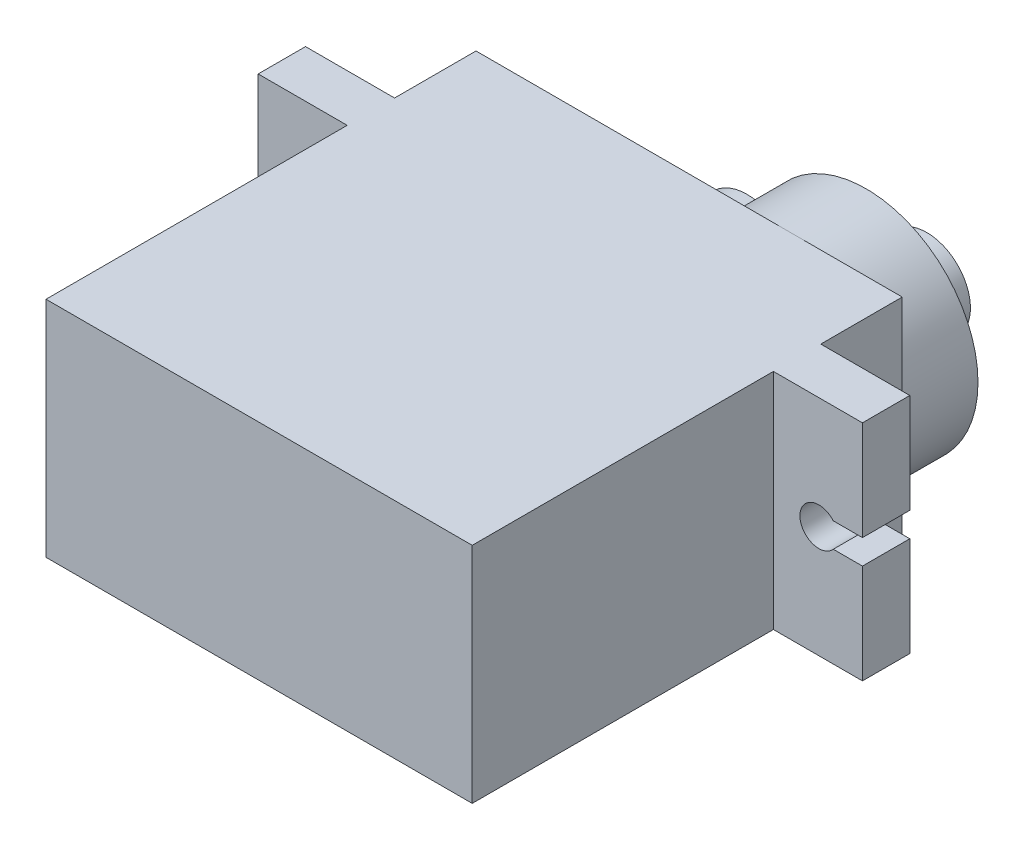
ISO-10303-21;
HEADER;
FILE_DESCRIPTION(('STEP AP214'),'2;1');
FILE_NAME('part.step','',(''),(''),'','','');
FILE_SCHEMA(('AUTOMOTIVE_DESIGN { 1 0 10303 214 1 1 1 1 }'));
ENDSEC;
DATA;
#1=APPLICATION_CONTEXT('core data for automotive mechanical design processes');
#2=APPLICATION_PROTOCOL_DEFINITION('international standard','automotive_design',2000,#1);
#3=PRODUCT_CONTEXT('',#1,'mechanical');
#4=PRODUCT('Part','Part','',(#3));
#5=PRODUCT_RELATED_PRODUCT_CATEGORY('part','',(#4));
#6=PRODUCT_DEFINITION_FORMATION('','',#4);
#7=PRODUCT_DEFINITION_CONTEXT('part definition',#1,'design');
#8=PRODUCT_DEFINITION('design','',#6,#7);
#9=PRODUCT_DEFINITION_SHAPE('','',#8);
#10=(LENGTH_UNIT() NAMED_UNIT(*) SI_UNIT(.MILLI.,.METRE.));
#11=(NAMED_UNIT(*) PLANE_ANGLE_UNIT() SI_UNIT($,.RADIAN.));
#12=(NAMED_UNIT(*) SI_UNIT($,.STERADIAN.) SOLID_ANGLE_UNIT());
#13=UNCERTAINTY_MEASURE_WITH_UNIT(LENGTH_MEASURE(1.E-05),#10,'distance_accuracy_value','');
#14=(GEOMETRIC_REPRESENTATION_CONTEXT(3) GLOBAL_UNCERTAINTY_ASSIGNED_CONTEXT((#13)) GLOBAL_UNIT_ASSIGNED_CONTEXT((#10,
#11,#12)) REPRESENTATION_CONTEXT('',''));
#15=CARTESIAN_POINT('',(0.,0.,0.));
#16=DIRECTION('',(0.,0.,1.));
#17=DIRECTION('',(1.,0.,0.));
#18=AXIS2_PLACEMENT_3D('',#15,#16,#17);
#19=CARTESIAN_POINT('',(27.2,0.,-18.4));
#20=DIRECTION('',(1.,0.,0.));
#21=DIRECTION('',(0.,0.,-1.));
#22=AXIS2_PLACEMENT_3D('',#19,#20,#21);
#23=PLANE('',#22);
#24=DIRECTION('',(0.,0.,-1.));
#25=VECTOR('',#24,1.);
#26=CARTESIAN_POINT('',(27.2,5.25,-15.2));
#27=LINE('',#26,#25);
#28=CARTESIAN_POINT('',(27.2,5.25,-15.9));
#29=VERTEX_POINT('',#28);
#30=CARTESIAN_POINT('',(27.2,5.25,-18.4));
#31=VERTEX_POINT('',#30);
#32=EDGE_CURVE('E216',#29,#31,#27,.T.);
#33=ORIENTED_EDGE('',*,*,#32,.F.);
#34=DIRECTION('',(0.,1.,0.));
#35=VECTOR('',#34,1.);
#36=CARTESIAN_POINT('',(27.2,0.,-15.9));
#37=LINE('',#36,#35);
#38=CARTESIAN_POINT('',(27.2,0.,-15.9));
#39=VERTEX_POINT('',#38);
#40=EDGE_CURVE('E297',#39,#29,#37,.T.);
#41=ORIENTED_EDGE('',*,*,#40,.F.);
#42=DIRECTION('',(0.,0.,-1.));
#43=VECTOR('',#42,1.);
#44=CARTESIAN_POINT('',(27.2,0.,-18.4));
#45=LINE('',#44,#43);
#46=CARTESIAN_POINT('',(27.2,0.,-18.4));
#47=VERTEX_POINT('',#46);
#48=EDGE_CURVE('E272',#39,#47,#45,.T.);
#49=ORIENTED_EDGE('',*,*,#48,.T.);
#50=DIRECTION('',(0.,1.,0.));
#51=VECTOR('',#50,1.);
#52=CARTESIAN_POINT('',(27.2,0.,-18.4));
#53=LINE('',#52,#51);
#54=EDGE_CURVE('E294',#47,#31,#53,.T.);
#55=ORIENTED_EDGE('',*,*,#54,.T.);
#56=EDGE_LOOP('',(#33,#41,#49,#55));
#57=FACE_BOUND('',#56,.T.);
#58=ADVANCED_FACE('F33',(#57),#23,.T.);
#59=CARTESIAN_POINT('',(-4.7,0.,-18.4));
#60=DIRECTION('',(-1.,0.,0.));
#61=DIRECTION('',(0.,0.,1.));
#62=AXIS2_PLACEMENT_3D('',#59,#60,#61);
#63=PLANE('',#62);
#64=DIRECTION('',(0.,0.,-1.));
#65=VECTOR('',#64,1.);
#66=CARTESIAN_POINT('',(-4.7,6.55,-18.4));
#67=LINE('',#66,#65);
#68=CARTESIAN_POINT('',(-4.7,6.55,-15.9));
#69=VERTEX_POINT('',#68);
#70=CARTESIAN_POINT('',(-4.7,6.55,-18.4));
#71=VERTEX_POINT('',#70);
#72=EDGE_CURVE('E41',#69,#71,#67,.T.);
#73=ORIENTED_EDGE('',*,*,#72,.F.);
#74=DIRECTION('',(0.,1.,0.));
#75=VECTOR('',#74,1.);
#76=CARTESIAN_POINT('',(-4.7,0.,-15.9));
#77=LINE('',#76,#75);
#78=CARTESIAN_POINT('',(-4.7,11.8,-15.9));
#79=VERTEX_POINT('',#78);
#80=EDGE_CURVE('E278',#69,#79,#77,.T.);
#81=ORIENTED_EDGE('',*,*,#80,.T.);
#82=DIRECTION('',(0.,0.,1.));
#83=VECTOR('',#82,1.);
#84=CARTESIAN_POINT('',(-4.7,11.8,-18.4));
#85=LINE('',#84,#83);
#86=CARTESIAN_POINT('',(-4.7,11.8,-18.4));
#87=VERTEX_POINT('',#86);
#88=EDGE_CURVE('E264',#87,#79,#85,.T.);
#89=ORIENTED_EDGE('',*,*,#88,.F.);
#90=DIRECTION('',(0.,1.,0.));
#91=VECTOR('',#90,1.);
#92=CARTESIAN_POINT('',(-4.7,0.,-18.4));
#93=LINE('',#92,#91);
#94=EDGE_CURVE('E293',#71,#87,#93,.T.);
#95=ORIENTED_EDGE('',*,*,#94,.F.);
#96=EDGE_LOOP('',(#73,#81,#89,#95));
#97=FACE_BOUND('',#96,.T.);
#98=ADVANCED_FACE('F371',(#97),#63,.T.);
#99=CARTESIAN_POINT('',(0.,11.8,-22.7));
#100=DIRECTION('',(0.,0.,1.));
#101=DIRECTION('',(1.,0.,0.));
#102=AXIS2_PLACEMENT_3D('',#99,#100,#101);
#103=PLANE('',#102);
#104=CARTESIAN_POINT('',(10.3,5.9,-22.7));
#105=DIRECTION('',(0.,0.,-1.));
#106=DIRECTION('',(-1.,0.,0.));
#107=AXIS2_PLACEMENT_3D('',#104,#105,#106);
#108=CIRCLE('',#107,2.5);
#109=CARTESIAN_POINT('',(11.1833333333333,3.5612562726493,-22.7));
#110=VERTEX_POINT('',#109);
#111=CARTESIAN_POINT('',(11.1833333333333,8.2387437273507,-22.7));
#112=VERTEX_POINT('',#111);
#113=EDGE_CURVE('E243',#110,#112,#108,.T.);
#114=ORIENTED_EDGE('',*,*,#113,.F.);
#115=CARTESIAN_POINT('',(16.6,5.9,-22.7));
#116=DIRECTION('',(0.,0.,-1.));
#117=DIRECTION('',(-1.,0.,0.));
#118=AXIS2_PLACEMENT_3D('',#115,#116,#117);
#119=CIRCLE('',#118,5.9);
#120=CARTESIAN_POINT('',(16.6,0.,-22.7));
#121=VERTEX_POINT('',#120);
#122=EDGE_CURVE('E258',#121,#110,#119,.T.);
#123=ORIENTED_EDGE('',*,*,#122,.F.);
#124=DIRECTION('',(-1.,0.,0.));
#125=VECTOR('',#124,1.);
#126=CARTESIAN_POINT('',(0.,0.,-22.7));
#127=LINE('',#126,#125);
#128=CARTESIAN_POINT('',(0.,0.,-22.7));
#129=VERTEX_POINT('',#128);
#130=EDGE_CURVE('E340',#121,#129,#127,.T.);
#131=ORIENTED_EDGE('',*,*,#130,.T.);
#132=DIRECTION('',(0.,-1.,0.));
#133=VECTOR('',#132,1.);
#134=CARTESIAN_POINT('',(0.,11.8,-22.7));
#135=LINE('',#134,#133);
#136=CARTESIAN_POINT('',(0.,11.8,-22.7));
#137=VERTEX_POINT('',#136);
#138=EDGE_CURVE('E330',#137,#129,#135,.T.);
#139=ORIENTED_EDGE('',*,*,#138,.F.);
#140=DIRECTION('',(-1.,0.,0.));
#141=VECTOR('',#140,1.);
#142=CARTESIAN_POINT('',(0.,11.8,-22.7));
#143=LINE('',#142,#141);
#144=CARTESIAN_POINT('',(16.6,11.8,-22.7));
#145=VERTEX_POINT('',#144);
#146=EDGE_CURVE('E326',#145,#137,#143,.T.);
#147=ORIENTED_EDGE('',*,*,#146,.F.);
#148=EDGE_CURVE('E250',#112,#145,#119,.T.);
#149=ORIENTED_EDGE('',*,*,#148,.F.);
#150=EDGE_LOOP('',(#114,#123,#131,#139,#147,#149));
#151=FACE_BOUND('',#150,.T.);
#152=ADVANCED_FACE('F419',(#151),#103,.F.);
#153=CARTESIAN_POINT('',(22.5,5.9,-22.7));
#154=VERTEX_POINT('',#153);
#155=EDGE_CURVE('E257',#145,#154,#119,.T.);
#156=ORIENTED_EDGE('',*,*,#155,.F.);
#157=CARTESIAN_POINT('',(22.5,11.8,-22.7));
#158=VERTEX_POINT('',#157);
#159=EDGE_CURVE('E327',#158,#145,#143,.T.);
#160=ORIENTED_EDGE('',*,*,#159,.F.);
#161=DIRECTION('',(0.,-1.,0.));
#162=VECTOR('',#161,1.);
#163=CARTESIAN_POINT('',(22.5,11.8,-22.7));
#164=LINE('',#163,#162);
#165=EDGE_CURVE('E347',#158,#154,#164,.T.);
#166=ORIENTED_EDGE('',*,*,#165,.T.);
#167=EDGE_LOOP('',(#156,#160,#166));
#168=FACE_BOUND('',#167,.T.);
#169=ADVANCED_FACE('F476',(#168),#103,.F.);
#170=CARTESIAN_POINT('',(0.,11.8,0.));
#171=DIRECTION('',(1.,0.,0.));
#172=DIRECTION('',(0.,0.,-1.));
#173=AXIS2_PLACEMENT_3D('',#170,#171,#172);
#174=PLANE('',#173);
#175=DIRECTION('',(0.,0.,1.));
#176=VECTOR('',#175,1.);
#177=CARTESIAN_POINT('',(0.,0.,0.));
#178=LINE('',#177,#176);
#179=CARTESIAN_POINT('',(0.,0.,-18.4));
#180=VERTEX_POINT('',#179);
#181=EDGE_CURVE('E331',#129,#180,#178,.T.);
#182=ORIENTED_EDGE('',*,*,#181,.T.);
#183=DIRECTION('',(0.,1.,0.));
#184=VECTOR('',#183,1.);
#185=CARTESIAN_POINT('',(0.,11.8,-18.4));
#186=LINE('',#185,#184);
#187=CARTESIAN_POINT('',(0.,11.8,-18.4));
#188=VERTEX_POINT('',#187);
#189=EDGE_CURVE('E312',#180,#188,#186,.T.);
#190=ORIENTED_EDGE('',*,*,#189,.T.);
#191=DIRECTION('',(0.,0.,1.));
#192=VECTOR('',#191,1.);
#193=CARTESIAN_POINT('',(0.,11.8,0.));
#194=LINE('',#193,#192);
#195=EDGE_CURVE('E316',#137,#188,#194,.T.);
#196=ORIENTED_EDGE('',*,*,#195,.F.);
#197=ORIENTED_EDGE('',*,*,#138,.T.);
#198=EDGE_LOOP('',(#182,#190,#196,#197));
#199=FACE_BOUND('',#198,.T.);
#200=ADVANCED_FACE('F379',(#199),#174,.F.);
#201=CARTESIAN_POINT('',(22.5,11.8,0.));
#202=DIRECTION('',(-1.,0.,0.));
#203=DIRECTION('',(0.,0.,1.));
#204=AXIS2_PLACEMENT_3D('',#201,#202,#203);
#205=PLANE('',#204);
#206=DIRECTION('',(0.,0.,-1.));
#207=VECTOR('',#206,1.);
#208=CARTESIAN_POINT('',(22.5,11.8,0.));
#209=LINE('',#208,#207);
#210=CARTESIAN_POINT('',(22.5,11.8,-18.4));
#211=VERTEX_POINT('',#210);
#212=EDGE_CURVE('E322',#211,#158,#209,.T.);
#213=ORIENTED_EDGE('',*,*,#212,.F.);
#214=DIRECTION('',(0.,-1.,0.));
#215=VECTOR('',#214,1.);
#216=CARTESIAN_POINT('',(22.5,11.8,-18.4));
#217=LINE('',#216,#215);
#218=CARTESIAN_POINT('',(22.5,0.,-18.4));
#219=VERTEX_POINT('',#218);
#220=EDGE_CURVE('E309',#211,#219,#217,.T.);
#221=ORIENTED_EDGE('',*,*,#220,.T.);
#222=DIRECTION('',(0.,0.,-1.));
#223=VECTOR('',#222,1.);
#224=CARTESIAN_POINT('',(22.5,0.,0.));
#225=LINE('',#224,#223);
#226=CARTESIAN_POINT('',(22.5,0.,-22.7));
#227=VERTEX_POINT('',#226);
#228=EDGE_CURVE('E336',#219,#227,#225,.T.);
#229=ORIENTED_EDGE('',*,*,#228,.T.);
#230=EDGE_CURVE('E346',#154,#227,#164,.T.);
#231=ORIENTED_EDGE('',*,*,#230,.F.);
#232=ORIENTED_EDGE('',*,*,#165,.F.);
#233=EDGE_LOOP('',(#213,#221,#229,#231,#232));
#234=FACE_BOUND('',#233,.T.);
#235=ADVANCED_FACE('F460',(#234),#205,.F.);
#236=CARTESIAN_POINT('',(0.,11.8,-15.9));
#237=VERTEX_POINT('',#236);
#238=CARTESIAN_POINT('',(0.,11.8,0.));
#239=VERTEX_POINT('',#238);
#240=EDGE_CURVE('E320',#237,#239,#194,.T.);
#241=ORIENTED_EDGE('',*,*,#240,.F.);
#242=DIRECTION('',(0.,-1.,0.));
#243=VECTOR('',#242,1.);
#244=CARTESIAN_POINT('',(0.,11.8,-15.9));
#245=LINE('',#244,#243);
#246=CARTESIAN_POINT('',(0.,0.,-15.9));
#247=VERTEX_POINT('',#246);
#248=EDGE_CURVE('E306',#237,#247,#245,.T.);
#249=ORIENTED_EDGE('',*,*,#248,.T.);
#250=CARTESIAN_POINT('',(0.,0.,0.));
#251=VERTEX_POINT('',#250);
#252=EDGE_CURVE('E315',#247,#251,#178,.T.);
#253=ORIENTED_EDGE('',*,*,#252,.T.);
#254=DIRECTION('',(0.,-1.,0.));
#255=VECTOR('',#254,1.);
#256=CARTESIAN_POINT('',(0.,11.8,0.));
#257=LINE('',#256,#255);
#258=EDGE_CURVE('E353',#239,#251,#257,.T.);
#259=ORIENTED_EDGE('',*,*,#258,.F.);
#260=EDGE_LOOP('',(#241,#249,#253,#259));
#261=FACE_BOUND('',#260,.T.);
#262=ADVANCED_FACE('F35',(#261),#174,.F.);
#263=CARTESIAN_POINT('',(0.,11.8,0.));
#264=DIRECTION('',(0.,0.,-1.));
#265=DIRECTION('',(-1.,0.,0.));
#266=AXIS2_PLACEMENT_3D('',#263,#264,#265);
#267=PLANE('',#266);
#268=DIRECTION('',(1.,0.,0.));
#269=VECTOR('',#268,1.);
#270=CARTESIAN_POINT('',(0.,0.,0.));
#271=LINE('',#270,#269);
#272=CARTESIAN_POINT('',(22.5,0.,0.));
#273=VERTEX_POINT('',#272);
#274=EDGE_CURVE('E334',#251,#273,#271,.T.);
#275=ORIENTED_EDGE('',*,*,#274,.T.);
#276=DIRECTION('',(0.,-1.,0.));
#277=VECTOR('',#276,1.);
#278=CARTESIAN_POINT('',(22.5,11.8,0.));
#279=LINE('',#278,#277);
#280=CARTESIAN_POINT('',(22.5,11.8,0.));
#281=VERTEX_POINT('',#280);
#282=EDGE_CURVE('E350',#281,#273,#279,.T.);
#283=ORIENTED_EDGE('',*,*,#282,.F.);
#284=DIRECTION('',(1.,0.,0.));
#285=VECTOR('',#284,1.);
#286=CARTESIAN_POINT('',(0.,11.8,0.));
#287=LINE('',#286,#285);
#288=EDGE_CURVE('E319',#239,#281,#287,.T.);
#289=ORIENTED_EDGE('',*,*,#288,.F.);
#290=ORIENTED_EDGE('',*,*,#258,.T.);
#291=EDGE_LOOP('',(#275,#283,#289,#290));
#292=FACE_BOUND('',#291,.T.);
#293=ADVANCED_FACE('F450',(#292),#267,.F.);
#294=CARTESIAN_POINT('',(22.5,0.,-15.9));
#295=VERTEX_POINT('',#294);
#296=EDGE_CURVE('E337',#273,#295,#225,.T.);
#297=ORIENTED_EDGE('',*,*,#296,.T.);
#298=DIRECTION('',(0.,1.,0.));
#299=VECTOR('',#298,1.);
#300=CARTESIAN_POINT('',(22.5,11.8,-15.9));
#301=LINE('',#300,#299);
#302=CARTESIAN_POINT('',(22.5,11.8,-15.9));
#303=VERTEX_POINT('',#302);
#304=EDGE_CURVE('E292',#295,#303,#301,.T.);
#305=ORIENTED_EDGE('',*,*,#304,.T.);
#306=EDGE_CURVE('E323',#281,#303,#209,.T.);
#307=ORIENTED_EDGE('',*,*,#306,.F.);
#308=ORIENTED_EDGE('',*,*,#282,.T.);
#309=EDGE_LOOP('',(#297,#305,#307,#308));
#310=FACE_BOUND('',#309,.T.);
#311=ADVANCED_FACE('F445',(#310),#205,.F.);
#312=EDGE_CURVE('E473',#154,#121,#119,.T.);
#313=ORIENTED_EDGE('',*,*,#312,.F.);
#314=ORIENTED_EDGE('',*,*,#230,.T.);
#315=EDGE_CURVE('E341',#227,#121,#127,.T.);
#316=ORIENTED_EDGE('',*,*,#315,.T.);
#317=EDGE_LOOP('',(#313,#314,#316));
#318=FACE_BOUND('',#317,.T.);
#319=ADVANCED_FACE('F475',(#318),#103,.F.);
#320=CARTESIAN_POINT('',(0.,11.8,0.));
#321=DIRECTION('',(0.,-1.,0.));
#322=DIRECTION('',(0.,0.,-1.));
#323=AXIS2_PLACEMENT_3D('',#320,#321,#322);
#324=PLANE('',#323);
#325=ORIENTED_EDGE('',*,*,#306,.T.);
#326=DIRECTION('',(1.,0.,0.));
#327=VECTOR('',#326,1.);
#328=CARTESIAN_POINT('',(-4.7,11.8,-15.9));
#329=LINE('',#328,#327);
#330=CARTESIAN_POINT('',(27.2,11.8,-15.9));
#331=VERTEX_POINT('',#330);
#332=EDGE_CURVE('E281',#303,#331,#329,.T.);
#333=ORIENTED_EDGE('',*,*,#332,.T.);
#334=DIRECTION('',(0.,0.,-1.));
#335=VECTOR('',#334,1.);
#336=CARTESIAN_POINT('',(27.2,11.8,-18.4));
#337=LINE('',#336,#335);
#338=CARTESIAN_POINT('',(27.2,11.8,-18.4));
#339=VERTEX_POINT('',#338);
#340=EDGE_CURVE('E284',#331,#339,#337,.T.);
#341=ORIENTED_EDGE('',*,*,#340,.T.);
#342=DIRECTION('',(-1.,0.,0.));
#343=VECTOR('',#342,1.);
#344=CARTESIAN_POINT('',(-4.7,11.8,-18.4));
#345=LINE('',#344,#343);
#346=EDGE_CURVE('E269',#339,#211,#345,.T.);
#347=ORIENTED_EDGE('',*,*,#346,.T.);
#348=ORIENTED_EDGE('',*,*,#212,.T.);
#349=ORIENTED_EDGE('',*,*,#159,.T.);
#350=ORIENTED_EDGE('',*,*,#146,.T.);
#351=ORIENTED_EDGE('',*,*,#195,.T.);
#352=EDGE_CURVE('E287',#188,#87,#345,.T.);
#353=ORIENTED_EDGE('',*,*,#352,.T.);
#354=ORIENTED_EDGE('',*,*,#88,.T.);
#355=EDGE_CURVE('E282',#79,#237,#329,.T.);
#356=ORIENTED_EDGE('',*,*,#355,.T.);
#357=ORIENTED_EDGE('',*,*,#240,.T.);
#358=ORIENTED_EDGE('',*,*,#288,.T.);
#359=EDGE_LOOP('',(#325,#333,#341,#347,#348,#349,#350,#351,#353,#354,#356,#357,#358));
#360=FACE_BOUND('',#359,.T.);
#361=ADVANCED_FACE('F374',(#360),#324,.F.);
#362=CARTESIAN_POINT('',(0.,0.,0.));
#363=DIRECTION('',(0.,-1.,0.));
#364=DIRECTION('',(0.,0.,-1.));
#365=AXIS2_PLACEMENT_3D('',#362,#363,#364);
#366=PLANE('',#365);
#367=ORIENTED_EDGE('',*,*,#252,.F.);
#368=DIRECTION('',(1.,0.,0.));
#369=VECTOR('',#368,1.);
#370=CARTESIAN_POINT('',(-4.7,0.,-15.9));
#371=LINE('',#370,#369);
#372=CARTESIAN_POINT('',(-4.7,0.,-15.9));
#373=VERTEX_POINT('',#372);
#374=EDGE_CURVE('E270',#373,#247,#371,.T.);
#375=ORIENTED_EDGE('',*,*,#374,.F.);
#376=DIRECTION('',(0.,0.,1.));
#377=VECTOR('',#376,1.);
#378=CARTESIAN_POINT('',(-4.7,0.,-18.4));
#379=LINE('',#378,#377);
#380=CARTESIAN_POINT('',(-4.7,0.,-18.4));
#381=VERTEX_POINT('',#380);
#382=EDGE_CURVE('E265',#381,#373,#379,.T.);
#383=ORIENTED_EDGE('',*,*,#382,.F.);
#384=DIRECTION('',(-1.,0.,0.));
#385=VECTOR('',#384,1.);
#386=CARTESIAN_POINT('',(-4.7,0.,-18.4));
#387=LINE('',#386,#385);
#388=EDGE_CURVE('E275',#180,#381,#387,.T.);
#389=ORIENTED_EDGE('',*,*,#388,.F.);
#390=ORIENTED_EDGE('',*,*,#181,.F.);
#391=ORIENTED_EDGE('',*,*,#130,.F.);
#392=ORIENTED_EDGE('',*,*,#315,.F.);
#393=ORIENTED_EDGE('',*,*,#228,.F.);
#394=EDGE_CURVE('E276',#47,#219,#387,.T.);
#395=ORIENTED_EDGE('',*,*,#394,.F.);
#396=ORIENTED_EDGE('',*,*,#48,.F.);
#397=EDGE_CURVE('E268',#295,#39,#371,.T.);
#398=ORIENTED_EDGE('',*,*,#397,.F.);
#399=ORIENTED_EDGE('',*,*,#296,.F.);
#400=ORIENTED_EDGE('',*,*,#274,.F.);
#401=EDGE_LOOP('',(#367,#375,#383,#389,#390,#391,#392,#393,#395,#396,#398,#399,#400));
#402=FACE_BOUND('',#401,.T.);
#403=ADVANCED_FACE('F385',(#402),#366,.T.);
#404=DIRECTION('',(0.,0.,-1.));
#405=VECTOR('',#404,1.);
#406=CARTESIAN_POINT('',(27.2,6.55,-15.2));
#407=LINE('',#406,#405);
#408=CARTESIAN_POINT('',(27.2,6.55,-15.9));
#409=VERTEX_POINT('',#408);
#410=CARTESIAN_POINT('',(27.2,6.55,-18.4));
#411=VERTEX_POINT('',#410);
#412=EDGE_CURVE('E200',#409,#411,#407,.T.);
#413=ORIENTED_EDGE('',*,*,#412,.T.);
#414=EDGE_CURVE('E211',#411,#339,#53,.T.);
#415=ORIENTED_EDGE('',*,*,#414,.T.);
#416=ORIENTED_EDGE('',*,*,#340,.F.);
#417=EDGE_CURVE('E300',#409,#331,#37,.T.);
#418=ORIENTED_EDGE('',*,*,#417,.F.);
#419=EDGE_LOOP('',(#413,#415,#416,#418));
#420=FACE_BOUND('',#419,.T.);
#421=ADVANCED_FACE('F415',(#420),#23,.T.);
#422=CARTESIAN_POINT('',(-4.7,0.,-15.9));
#423=DIRECTION('',(0.,0.,1.));
#424=DIRECTION('',(1.,0.,0.));
#425=AXIS2_PLACEMENT_3D('',#422,#423,#424);
#426=PLANE('',#425);
#427=DIRECTION('',(1.,0.,0.));
#428=VECTOR('',#427,1.);
#429=CARTESIAN_POINT('',(-4.7,5.25,-15.9));
#430=LINE('',#429,#428);
#431=CARTESIAN_POINT('',(25.6599342076785,5.25,-15.9));
#432=VERTEX_POINT('',#431);
#433=EDGE_CURVE('E237',#432,#29,#430,.T.);
#434=ORIENTED_EDGE('',*,*,#433,.F.);
#435=CARTESIAN_POINT('',(24.9,5.9,-15.9));
#436=DIRECTION('',(0.,0.,1.));
#437=DIRECTION('',(1.,0.,0.));
#438=AXIS2_PLACEMENT_3D('',#435,#436,#437);
#439=CIRCLE('',#438,1.);
#440=CARTESIAN_POINT('',(25.6599342076785,6.55,-15.9));
#441=VERTEX_POINT('',#440);
#442=EDGE_CURVE('E234',#441,#432,#439,.T.);
#443=ORIENTED_EDGE('',*,*,#442,.F.);
#444=DIRECTION('',(-1.,0.,0.));
#445=VECTOR('',#444,1.);
#446=CARTESIAN_POINT('',(-4.7,6.55,-15.9));
#447=LINE('',#446,#445);
#448=EDGE_CURVE('E197',#409,#441,#447,.T.);
#449=ORIENTED_EDGE('',*,*,#448,.F.);
#450=ORIENTED_EDGE('',*,*,#417,.T.);
#451=ORIENTED_EDGE('',*,*,#332,.F.);
#452=ORIENTED_EDGE('',*,*,#304,.F.);
#453=ORIENTED_EDGE('',*,*,#397,.T.);
#454=ORIENTED_EDGE('',*,*,#40,.T.);
#455=EDGE_LOOP('',(#434,#443,#449,#450,#451,#452,#453,#454));
#456=FACE_BOUND('',#455,.T.);
#457=ADVANCED_FACE('F425',(#456),#426,.T.);
#458=CARTESIAN_POINT('',(-4.7,0.,-18.4));
#459=DIRECTION('',(0.,0.,-1.));
#460=DIRECTION('',(-1.,0.,0.));
#461=AXIS2_PLACEMENT_3D('',#458,#459,#460);
#462=PLANE('',#461);
#463=DIRECTION('',(-1.,0.,0.));
#464=VECTOR('',#463,1.);
#465=CARTESIAN_POINT('',(27.2,5.25,-18.4));
#466=LINE('',#465,#464);
#467=CARTESIAN_POINT('',(25.6599342076785,5.25,-18.4));
#468=VERTEX_POINT('',#467);
#469=EDGE_CURVE('E48',#31,#468,#466,.T.);
#470=ORIENTED_EDGE('',*,*,#469,.F.);
#471=ORIENTED_EDGE('',*,*,#54,.F.);
#472=ORIENTED_EDGE('',*,*,#394,.T.);
#473=ORIENTED_EDGE('',*,*,#220,.F.);
#474=ORIENTED_EDGE('',*,*,#346,.F.);
#475=ORIENTED_EDGE('',*,*,#414,.F.);
#476=DIRECTION('',(1.,0.,0.));
#477=VECTOR('',#476,1.);
#478=CARTESIAN_POINT('',(27.2,6.55,-18.4));
#479=LINE('',#478,#477);
#480=CARTESIAN_POINT('',(25.6599342076785,6.55,-18.4));
#481=VERTEX_POINT('',#480);
#482=EDGE_CURVE('E194',#481,#411,#479,.T.);
#483=ORIENTED_EDGE('',*,*,#482,.F.);
#484=CARTESIAN_POINT('',(24.9,5.9,-18.4));
#485=DIRECTION('',(0.,0.,-1.));
#486=DIRECTION('',(-1.,0.,0.));
#487=AXIS2_PLACEMENT_3D('',#484,#485,#486);
#488=CIRCLE('',#487,1.);
#489=EDGE_CURVE('E204',#468,#481,#488,.T.);
#490=ORIENTED_EDGE('',*,*,#489,.F.);
#491=EDGE_LOOP('',(#470,#471,#472,#473,#474,#475,#483,#490));
#492=FACE_BOUND('',#491,.T.);
#493=ADVANCED_FACE('F209',(#492),#462,.T.);
#494=DIRECTION('',(1.,0.,0.));
#495=VECTOR('',#494,1.);
#496=CARTESIAN_POINT('',(-4.7,6.55,-18.4));
#497=LINE('',#496,#495);
#498=CARTESIAN_POINT('',(-3.15993420767853,6.55,-18.4));
#499=VERTEX_POINT('',#498);
#500=EDGE_CURVE('E224',#71,#499,#497,.T.);
#501=ORIENTED_EDGE('',*,*,#500,.F.);
#502=ORIENTED_EDGE('',*,*,#94,.T.);
#503=ORIENTED_EDGE('',*,*,#352,.F.);
#504=ORIENTED_EDGE('',*,*,#189,.F.);
#505=ORIENTED_EDGE('',*,*,#388,.T.);
#506=CARTESIAN_POINT('',(-4.7,5.25,-18.4));
#507=VERTEX_POINT('',#506);
#508=EDGE_CURVE('E289',#381,#507,#93,.T.);
#509=ORIENTED_EDGE('',*,*,#508,.T.);
#510=DIRECTION('',(-1.,0.,0.));
#511=VECTOR('',#510,1.);
#512=CARTESIAN_POINT('',(-4.7,5.25,-18.4));
#513=LINE('',#512,#511);
#514=CARTESIAN_POINT('',(-3.15993420767853,5.25,-18.4));
#515=VERTEX_POINT('',#514);
#516=EDGE_CURVE('E56',#515,#507,#513,.T.);
#517=ORIENTED_EDGE('',*,*,#516,.F.);
#518=CARTESIAN_POINT('',(-2.4,5.9,-18.4));
#519=DIRECTION('',(0.,0.,-1.));
#520=DIRECTION('',(1.,0.,0.));
#521=AXIS2_PLACEMENT_3D('',#518,#519,#520);
#522=CIRCLE('',#521,1.);
#523=EDGE_CURVE('E220',#499,#515,#522,.T.);
#524=ORIENTED_EDGE('',*,*,#523,.F.);
#525=EDGE_LOOP('',(#501,#502,#503,#504,#505,#509,#517,#524));
#526=FACE_BOUND('',#525,.T.);
#527=ADVANCED_FACE('F368',(#526),#462,.T.);
#528=DIRECTION('',(-1.,0.,0.));
#529=VECTOR('',#528,1.);
#530=CARTESIAN_POINT('',(-4.7,6.55,-15.9));
#531=LINE('',#530,#529);
#532=CARTESIAN_POINT('',(-3.15993420767853,6.55,-15.9));
#533=VERTEX_POINT('',#532);
#534=EDGE_CURVE('E232',#533,#69,#531,.T.);
#535=ORIENTED_EDGE('',*,*,#534,.F.);
#536=CARTESIAN_POINT('',(-2.4,5.9,-15.9));
#537=DIRECTION('',(0.,0.,1.));
#538=DIRECTION('',(1.,0.,0.));
#539=AXIS2_PLACEMENT_3D('',#536,#537,#538);
#540=CIRCLE('',#539,1.);
#541=CARTESIAN_POINT('',(-3.15993420767853,5.25,-15.9));
#542=VERTEX_POINT('',#541);
#543=EDGE_CURVE('E11',#542,#533,#540,.T.);
#544=ORIENTED_EDGE('',*,*,#543,.F.);
#545=DIRECTION('',(1.,0.,0.));
#546=VECTOR('',#545,1.);
#547=CARTESIAN_POINT('',(-4.7,5.25,-15.9));
#548=LINE('',#547,#546);
#549=CARTESIAN_POINT('',(-4.7,5.25,-15.9));
#550=VERTEX_POINT('',#549);
#551=EDGE_CURVE('E218',#550,#542,#548,.T.);
#552=ORIENTED_EDGE('',*,*,#551,.F.);
#553=EDGE_CURVE('E301',#373,#550,#77,.T.);
#554=ORIENTED_EDGE('',*,*,#553,.F.);
#555=ORIENTED_EDGE('',*,*,#374,.T.);
#556=ORIENTED_EDGE('',*,*,#248,.F.);
#557=ORIENTED_EDGE('',*,*,#355,.F.);
#558=ORIENTED_EDGE('',*,*,#80,.F.);
#559=EDGE_LOOP('',(#535,#544,#552,#554,#555,#556,#557,#558));
#560=FACE_BOUND('',#559,.T.);
#561=ADVANCED_FACE('F397',(#560),#426,.T.);
#562=DIRECTION('',(0.,0.,1.));
#563=VECTOR('',#562,1.);
#564=CARTESIAN_POINT('',(-4.7,5.25,-18.4));
#565=LINE('',#564,#563);
#566=EDGE_CURVE('E356',#507,#550,#565,.T.);
#567=ORIENTED_EDGE('',*,*,#566,.F.);
#568=ORIENTED_EDGE('',*,*,#508,.F.);
#569=ORIENTED_EDGE('',*,*,#382,.T.);
#570=ORIENTED_EDGE('',*,*,#553,.T.);
#571=EDGE_LOOP('',(#567,#568,#569,#570));
#572=FACE_BOUND('',#571,.T.);
#573=ADVANCED_FACE('F391',(#572),#63,.T.);
#574=CARTESIAN_POINT('',(10.3,5.9,-26.7));
#575=DIRECTION('',(0.,0.,1.));
#576=DIRECTION('',(1.,0.,0.));
#577=AXIS2_PLACEMENT_3D('',#574,#575,#576);
#578=CYLINDRICAL_SURFACE('',#577,2.5);
#579=ORIENTED_EDGE('',*,*,#113,.T.);
#580=DIRECTION('',(0.,0.,1.));
#581=VECTOR('',#580,1.);
#582=CARTESIAN_POINT('',(11.1833333333333,8.2387437273507,-26.7));
#583=LINE('',#582,#581);
#584=CARTESIAN_POINT('',(11.1833333333333,8.2387437273507,-26.7));
#585=VERTEX_POINT('',#584);
#586=EDGE_CURVE('E261',#585,#112,#583,.T.);
#587=ORIENTED_EDGE('',*,*,#586,.F.);
#588=CARTESIAN_POINT('',(10.3,5.9,-26.7));
#589=DIRECTION('',(0.,0.,-1.));
#590=DIRECTION('',(-1.,0.,0.));
#591=AXIS2_PLACEMENT_3D('',#588,#589,#590);
#592=CIRCLE('',#591,2.5);
#593=CARTESIAN_POINT('',(11.1833333333333,3.5612562726493,-26.7));
#594=VERTEX_POINT('',#593);
#595=EDGE_CURVE('E246',#594,#585,#592,.T.);
#596=ORIENTED_EDGE('',*,*,#595,.F.);
#597=DIRECTION('',(0.,0.,1.));
#598=VECTOR('',#597,1.);
#599=CARTESIAN_POINT('',(11.1833333333333,3.5612562726493,-26.7));
#600=LINE('',#599,#598);
#601=EDGE_CURVE('E252',#594,#110,#600,.T.);
#602=ORIENTED_EDGE('',*,*,#601,.T.);
#603=EDGE_LOOP('',(#579,#587,#596,#602));
#604=FACE_BOUND('',#603,.T.);
#605=ADVANCED_FACE('F569',(#604),#578,.T.);
#606=CARTESIAN_POINT('',(16.6,5.9,-26.7));
#607=DIRECTION('',(0.,0.,1.));
#608=DIRECTION('',(1.,0.,0.));
#609=AXIS2_PLACEMENT_3D('',#606,#607,#608);
#610=CYLINDRICAL_SURFACE('',#609,5.9);
#611=ORIENTED_EDGE('',*,*,#148,.T.);
#612=ORIENTED_EDGE('',*,*,#155,.T.);
#613=ORIENTED_EDGE('',*,*,#312,.T.);
#614=ORIENTED_EDGE('',*,*,#122,.T.);
#615=ORIENTED_EDGE('',*,*,#601,.F.);
#616=CARTESIAN_POINT('',(16.6,5.9,-26.7));
#617=DIRECTION('',(0.,0.,-1.));
#618=DIRECTION('',(-1.,0.,0.));
#619=AXIS2_PLACEMENT_3D('',#616,#617,#618);
#620=CIRCLE('',#619,5.9);
#621=EDGE_CURVE('E249',#585,#594,#620,.T.);
#622=ORIENTED_EDGE('',*,*,#621,.F.);
#623=ORIENTED_EDGE('',*,*,#586,.T.);
#624=EDGE_LOOP('',(#611,#612,#613,#614,#615,#622,#623));
#625=FACE_BOUND('',#624,.T.);
#626=ADVANCED_FACE('F467',(#625),#610,.T.);
#627=CARTESIAN_POINT('',(13.45,5.9,-26.7));
#628=DIRECTION('',(0.,0.,-1.));
#629=DIRECTION('',(-1.,0.,0.));
#630=AXIS2_PLACEMENT_3D('',#627,#628,#629);
#631=PLANE('',#630);
#632=CARTESIAN_POINT('',(16.6,5.9,-26.7));
#633=DIRECTION('',(0.,0.,-1.));
#634=DIRECTION('',(-1.,0.,0.));
#635=AXIS2_PLACEMENT_3D('',#632,#633,#634);
#636=CIRCLE('',#635,2.3);
#637=CARTESIAN_POINT('',(14.3,5.9,-26.7));
#638=VERTEX_POINT('',#637);
#639=EDGE_CURVE('E239',#638,#638,#636,.T.);
#640=ORIENTED_EDGE('',*,*,#639,.F.);
#641=EDGE_LOOP('',(#640));
#642=FACE_BOUND('',#641,.T.);
#643=ORIENTED_EDGE('',*,*,#595,.T.);
#644=ORIENTED_EDGE('',*,*,#621,.T.);
#645=EDGE_LOOP('',(#643,#644));
#646=FACE_BOUND('',#645,.T.);
#647=ADVANCED_FACE('F592',(#642,#646),#631,.T.);
#648=CARTESIAN_POINT('',(16.6,5.9,-29.9));
#649=DIRECTION('',(0.,0.,1.));
#650=DIRECTION('',(1.,0.,0.));
#651=AXIS2_PLACEMENT_3D('',#648,#649,#650);
#652=CYLINDRICAL_SURFACE('',#651,2.3);
#653=CARTESIAN_POINT('',(16.6,5.9,-29.9));
#654=DIRECTION('',(0.,0.,-1.));
#655=DIRECTION('',(-1.,0.,0.));
#656=AXIS2_PLACEMENT_3D('',#653,#654,#655);
#657=CIRCLE('',#656,2.3);
#658=CARTESIAN_POINT('',(14.3,5.9,-29.9));
#659=VERTEX_POINT('',#658);
#660=EDGE_CURVE('E240',#659,#659,#657,.T.);
#661=ORIENTED_EDGE('',*,*,#660,.F.);
#662=EDGE_LOOP('',(#661));
#663=FACE_BOUND('',#662,.T.);
#664=ORIENTED_EDGE('',*,*,#639,.T.);
#665=EDGE_LOOP('',(#664));
#666=FACE_BOUND('',#665,.T.);
#667=ADVANCED_FACE('F408',(#663,#666),#652,.T.);
#668=CARTESIAN_POINT('',(16.6,5.9,-29.9));
#669=DIRECTION('',(0.,0.,-1.));
#670=DIRECTION('',(-1.,0.,0.));
#671=AXIS2_PLACEMENT_3D('',#668,#669,#670);
#672=PLANE('',#671);
#673=ORIENTED_EDGE('',*,*,#660,.T.);
#674=EDGE_LOOP('',(#673));
#675=FACE_BOUND('',#674,.T.);
#676=ADVANCED_FACE('F401',(#675),#672,.T.);
#677=CARTESIAN_POINT('',(-2.4,5.9,-15.2));
#678=DIRECTION('',(0.,0.,-1.));
#679=DIRECTION('',(-1.,0.,0.));
#680=AXIS2_PLACEMENT_3D('',#677,#678,#679);
#681=CYLINDRICAL_SURFACE('',#680,1.);
#682=ORIENTED_EDGE('',*,*,#543,.T.);
#683=DIRECTION('',(0.,0.,-1.));
#684=VECTOR('',#683,1.);
#685=CARTESIAN_POINT('',(-3.15993420767853,6.55,-15.2));
#686=LINE('',#685,#684);
#687=EDGE_CURVE('E228',#533,#499,#686,.T.);
#688=ORIENTED_EDGE('',*,*,#687,.T.);
#689=ORIENTED_EDGE('',*,*,#523,.T.);
#690=DIRECTION('',(0.,0.,-1.));
#691=VECTOR('',#690,1.);
#692=CARTESIAN_POINT('',(-3.15993420767853,5.25,-15.2));
#693=LINE('',#692,#691);
#694=EDGE_CURVE('E227',#542,#515,#693,.T.);
#695=ORIENTED_EDGE('',*,*,#694,.F.);
#696=EDGE_LOOP('',(#682,#688,#689,#695));
#697=FACE_BOUND('',#696,.T.);
#698=ADVANCED_FACE('F399',(#697),#681,.F.);
#699=CARTESIAN_POINT('',(-4.7,6.55,-15.2));
#700=DIRECTION('',(0.,1.,0.));
#701=DIRECTION('',(0.,0.,1.));
#702=AXIS2_PLACEMENT_3D('',#699,#700,#701);
#703=PLANE('',#702);
#704=ORIENTED_EDGE('',*,*,#534,.T.);
#705=ORIENTED_EDGE('',*,*,#72,.T.);
#706=ORIENTED_EDGE('',*,*,#500,.T.);
#707=ORIENTED_EDGE('',*,*,#687,.F.);
#708=EDGE_LOOP('',(#704,#705,#706,#707));
#709=FACE_BOUND('',#708,.T.);
#710=ADVANCED_FACE('F360',(#709),#703,.F.);
#711=CARTESIAN_POINT('',(-4.7,5.25,-15.2));
#712=DIRECTION('',(0.,-1.,0.));
#713=DIRECTION('',(0.,0.,-1.));
#714=AXIS2_PLACEMENT_3D('',#711,#712,#713);
#715=PLANE('',#714);
#716=ORIENTED_EDGE('',*,*,#551,.T.);
#717=ORIENTED_EDGE('',*,*,#694,.T.);
#718=ORIENTED_EDGE('',*,*,#516,.T.);
#719=ORIENTED_EDGE('',*,*,#566,.T.);
#720=EDGE_LOOP('',(#716,#717,#718,#719));
#721=FACE_BOUND('',#720,.T.);
#722=ADVANCED_FACE('F393',(#721),#715,.F.);
#723=CARTESIAN_POINT('',(27.2,5.25,-15.2));
#724=DIRECTION('',(0.,-1.,0.));
#725=DIRECTION('',(0.,0.,-1.));
#726=AXIS2_PLACEMENT_3D('',#723,#724,#725);
#727=PLANE('',#726);
#728=ORIENTED_EDGE('',*,*,#433,.T.);
#729=ORIENTED_EDGE('',*,*,#32,.T.);
#730=ORIENTED_EDGE('',*,*,#469,.T.);
#731=DIRECTION('',(0.,0.,-1.));
#732=VECTOR('',#731,1.);
#733=CARTESIAN_POINT('',(25.6599342076785,5.25,-15.2));
#734=LINE('',#733,#732);
#735=EDGE_CURVE('E201',#432,#468,#734,.T.);
#736=ORIENTED_EDGE('',*,*,#735,.F.);
#737=EDGE_LOOP('',(#728,#729,#730,#736));
#738=FACE_BOUND('',#737,.T.);
#739=ADVANCED_FACE('F437',(#738),#727,.F.);
#740=CARTESIAN_POINT('',(27.2,6.55,-15.2));
#741=DIRECTION('',(0.,1.,0.));
#742=DIRECTION('',(0.,0.,1.));
#743=AXIS2_PLACEMENT_3D('',#740,#741,#742);
#744=PLANE('',#743);
#745=ORIENTED_EDGE('',*,*,#448,.T.);
#746=DIRECTION('',(0.,0.,-1.));
#747=VECTOR('',#746,1.);
#748=CARTESIAN_POINT('',(25.6599342076785,6.55,-15.2));
#749=LINE('',#748,#747);
#750=EDGE_CURVE('E190',#441,#481,#749,.T.);
#751=ORIENTED_EDGE('',*,*,#750,.T.);
#752=ORIENTED_EDGE('',*,*,#482,.T.);
#753=ORIENTED_EDGE('',*,*,#412,.F.);
#754=EDGE_LOOP('',(#745,#751,#752,#753));
#755=FACE_BOUND('',#754,.T.);
#756=ADVANCED_FACE('F192',(#755),#744,.F.);
#757=CARTESIAN_POINT('',(24.9,5.9,-15.2));
#758=DIRECTION('',(0.,0.,-1.));
#759=DIRECTION('',(-1.,0.,0.));
#760=AXIS2_PLACEMENT_3D('',#757,#758,#759);
#761=CYLINDRICAL_SURFACE('',#760,1.);
#762=ORIENTED_EDGE('',*,*,#442,.T.);
#763=ORIENTED_EDGE('',*,*,#735,.T.);
#764=ORIENTED_EDGE('',*,*,#489,.T.);
#765=ORIENTED_EDGE('',*,*,#750,.F.);
#766=EDGE_LOOP('',(#762,#763,#764,#765));
#767=FACE_BOUND('',#766,.T.);
#768=ADVANCED_FACE('F205',(#767),#761,.F.);
#769=CLOSED_SHELL('',(#58,#98,#152,#169,#200,#235,#262,#293,#311,#319,#361,#403,#421,#457,#493,
#527,#561,#573,#605,#626,#647,#667,#676,#698,#710,#722,#739,#756,#768));
#770=MANIFOLD_SOLID_BREP('B2',#769);
#771=ADVANCED_BREP_SHAPE_REPRESENTATION('',(#18,#770),#14);
#772=SHAPE_DEFINITION_REPRESENTATION(#9,#771);
ENDSEC;
END-ISO-10303-21;
